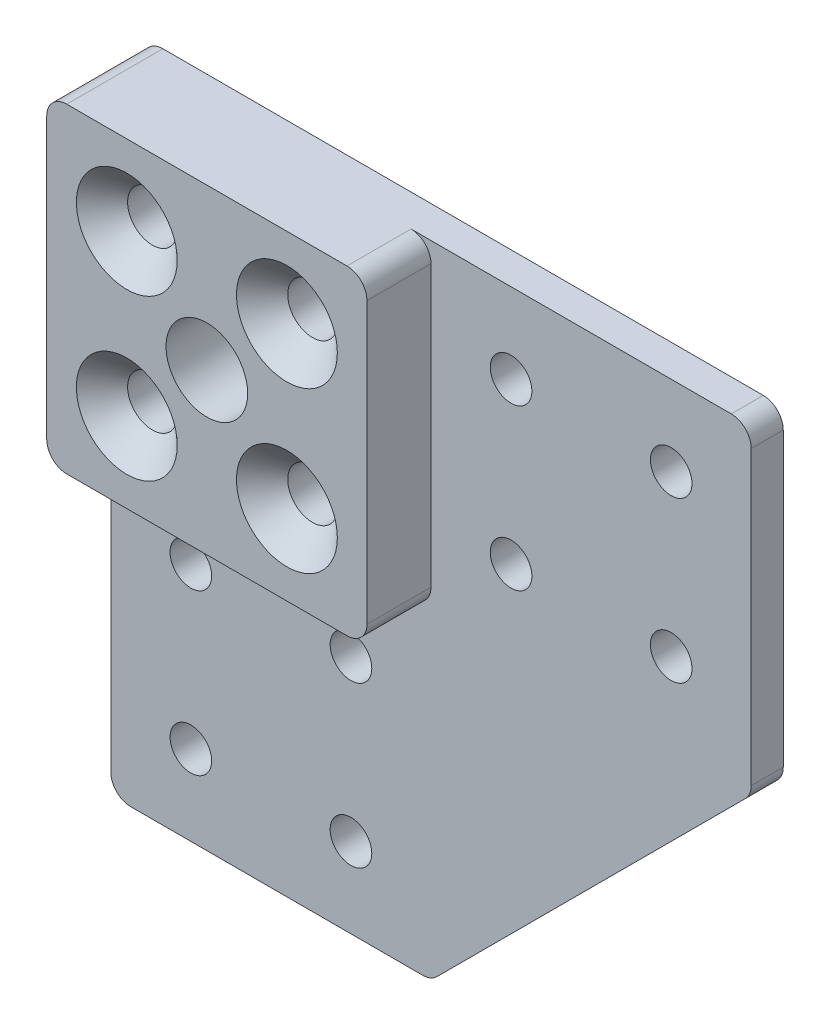
ISO-10303-21;
HEADER;
FILE_DESCRIPTION(('STEP AP214'),'2;1');
FILE_NAME('part.step','',(''),(''),'','','');
FILE_SCHEMA(('AUTOMOTIVE_DESIGN { 1 0 10303 214 1 1 1 1 }'));
ENDSEC;
DATA;
#1=APPLICATION_CONTEXT('core data for automotive mechanical design processes');
#2=APPLICATION_PROTOCOL_DEFINITION('international standard','automotive_design',2000,#1);
#3=PRODUCT_CONTEXT('',#1,'mechanical');
#4=PRODUCT('Part','Part','',(#3));
#5=PRODUCT_RELATED_PRODUCT_CATEGORY('part','',(#4));
#6=PRODUCT_DEFINITION_FORMATION('','',#4);
#7=PRODUCT_DEFINITION_CONTEXT('part definition',#1,'design');
#8=PRODUCT_DEFINITION('design','',#6,#7);
#9=PRODUCT_DEFINITION_SHAPE('','',#8);
#10=(LENGTH_UNIT() NAMED_UNIT(*) SI_UNIT(.MILLI.,.METRE.));
#11=(NAMED_UNIT(*) PLANE_ANGLE_UNIT() SI_UNIT($,.RADIAN.));
#12=(NAMED_UNIT(*) SI_UNIT($,.STERADIAN.) SOLID_ANGLE_UNIT());
#13=UNCERTAINTY_MEASURE_WITH_UNIT(LENGTH_MEASURE(1.E-05),#10,'distance_accuracy_value','');
#14=(GEOMETRIC_REPRESENTATION_CONTEXT(3) GLOBAL_UNCERTAINTY_ASSIGNED_CONTEXT((#13)) GLOBAL_UNIT_ASSIGNED_CONTEXT((#10,
#11,#12)) REPRESENTATION_CONTEXT('',''));
#15=CARTESIAN_POINT('',(0.,0.,0.));
#16=DIRECTION('',(0.,0.,1.));
#17=DIRECTION('',(1.,0.,0.));
#18=AXIS2_PLACEMENT_3D('',#15,#16,#17);
#19=CARTESIAN_POINT('',(0.,0.,4.));
#20=DIRECTION('',(0.,0.,-1.));
#21=DIRECTION('',(-1.,0.,0.));
#22=AXIS2_PLACEMENT_3D('',#19,#20,#21);
#23=PLANE('',#22);
#24=CARTESIAN_POINT('',(70.,-10.0000000000002,4.));
#25=DIRECTION('',(0.,0.,1.));
#26=DIRECTION('',(-1.,0.,0.));
#27=AXIS2_PLACEMENT_3D('',#24,#25,#26);
#28=CIRCLE('',#27,2.60000000000001);
#29=CARTESIAN_POINT('',(67.4,-10.0000000000002,4.));
#30=VERTEX_POINT('',#29);
#31=EDGE_CURVE('E815',#30,#30,#28,.T.);
#32=ORIENTED_EDGE('',*,*,#31,.F.);
#33=EDGE_LOOP('',(#32));
#34=FACE_BOUND('',#33,.T.);
#35=CARTESIAN_POINT('',(10.0000000000002,-70.,4.));
#36=DIRECTION('',(0.,0.,1.));
#37=DIRECTION('',(1.,0.,0.));
#38=AXIS2_PLACEMENT_3D('',#35,#36,#37);
#39=CIRCLE('',#38,2.6);
#40=CARTESIAN_POINT('',(12.6000000000002,-70.,4.));
#41=VERTEX_POINT('',#40);
#42=EDGE_CURVE('E821',#41,#41,#39,.T.);
#43=ORIENTED_EDGE('',*,*,#42,.F.);
#44=EDGE_LOOP('',(#43));
#45=FACE_BOUND('',#44,.T.);
#46=CARTESIAN_POINT('',(30.0000000000002,-70.,4.));
#47=DIRECTION('',(0.,0.,1.));
#48=DIRECTION('',(1.,0.,0.));
#49=AXIS2_PLACEMENT_3D('',#46,#47,#48);
#50=CIRCLE('',#49,2.6);
#51=CARTESIAN_POINT('',(32.6000000000002,-70.,4.));
#52=VERTEX_POINT('',#51);
#53=EDGE_CURVE('E803',#52,#52,#50,.T.);
#54=ORIENTED_EDGE('',*,*,#53,.F.);
#55=EDGE_LOOP('',(#54));
#56=FACE_BOUND('',#55,.T.);
#57=CARTESIAN_POINT('',(30.,-50.,4.));
#58=DIRECTION('',(0.,0.,1.));
#59=DIRECTION('',(1.,0.,0.));
#60=AXIS2_PLACEMENT_3D('',#57,#58,#59);
#61=CIRCLE('',#60,2.6);
#62=CARTESIAN_POINT('',(32.6,-50.,4.));
#63=VERTEX_POINT('',#62);
#64=EDGE_CURVE('E809',#63,#63,#61,.T.);
#65=ORIENTED_EDGE('',*,*,#64,.F.);
#66=EDGE_LOOP('',(#65));
#67=FACE_BOUND('',#66,.T.);
#68=CARTESIAN_POINT('',(70.,-30.0000000000002,4.));
#69=DIRECTION('',(0.,0.,1.));
#70=DIRECTION('',(-1.,0.,0.));
#71=AXIS2_PLACEMENT_3D('',#68,#69,#70);
#72=CIRCLE('',#71,2.60000000000001);
#73=CARTESIAN_POINT('',(67.4,-30.0000000000002,4.));
#74=VERTEX_POINT('',#73);
#75=EDGE_CURVE('E839',#74,#74,#72,.T.);
#76=ORIENTED_EDGE('',*,*,#75,.F.);
#77=EDGE_LOOP('',(#76));
#78=FACE_BOUND('',#77,.T.);
#79=CARTESIAN_POINT('',(50.,-30.,4.));
#80=DIRECTION('',(0.,0.,1.));
#81=DIRECTION('',(-1.,0.,0.));
#82=AXIS2_PLACEMENT_3D('',#79,#80,#81);
#83=CIRCLE('',#82,2.6);
#84=CARTESIAN_POINT('',(47.4,-30.,4.));
#85=VERTEX_POINT('',#84);
#86=EDGE_CURVE('E833',#85,#85,#83,.T.);
#87=ORIENTED_EDGE('',*,*,#86,.F.);
#88=EDGE_LOOP('',(#87));
#89=FACE_BOUND('',#88,.T.);
#90=CARTESIAN_POINT('',(50.,-9.99999999999999,4.));
#91=DIRECTION('',(0.,0.,1.));
#92=DIRECTION('',(-1.,0.,0.));
#93=AXIS2_PLACEMENT_3D('',#90,#91,#92);
#94=CIRCLE('',#93,2.6);
#95=CARTESIAN_POINT('',(47.4,-9.99999999999999,4.));
#96=VERTEX_POINT('',#95);
#97=EDGE_CURVE('E827',#96,#96,#94,.T.);
#98=ORIENTED_EDGE('',*,*,#97,.F.);
#99=EDGE_LOOP('',(#98));
#100=FACE_BOUND('',#99,.T.);
#101=CARTESIAN_POINT('',(10.,-50.,4.));
#102=DIRECTION('',(0.,0.,1.));
#103=DIRECTION('',(1.,0.,0.));
#104=AXIS2_PLACEMENT_3D('',#101,#102,#103);
#105=CIRCLE('',#104,2.6);
#106=CARTESIAN_POINT('',(12.6,-50.,4.));
#107=VERTEX_POINT('',#106);
#108=EDGE_CURVE('E797',#107,#107,#105,.T.);
#109=ORIENTED_EDGE('',*,*,#108,.F.);
#110=EDGE_LOOP('',(#109));
#111=FACE_BOUND('',#110,.T.);
#112=DIRECTION('',(0.,1.,0.));
#113=VECTOR('',#112,1.);
#114=CARTESIAN_POINT('',(80.,0.,4.));
#115=LINE('',#114,#113);
#116=CARTESIAN_POINT('',(80.,-38.9644660940673,4.));
#117=VERTEX_POINT('',#116);
#118=CARTESIAN_POINT('',(80.,-2.5,4.));
#119=VERTEX_POINT('',#118);
#120=EDGE_CURVE('E322',#117,#119,#115,.T.);
#121=ORIENTED_EDGE('',*,*,#120,.T.);
#122=CARTESIAN_POINT('',(77.5,-2.5,4.));
#123=DIRECTION('',(0.,0.,-1.));
#124=DIRECTION('',(-1.,0.,0.));
#125=AXIS2_PLACEMENT_3D('',#122,#123,#124);
#126=CIRCLE('',#125,2.5);
#127=CARTESIAN_POINT('',(77.5,0.,4.));
#128=VERTEX_POINT('',#127);
#129=EDGE_CURVE('E225',#119,#128,#126,.F.);
#130=ORIENTED_EDGE('',*,*,#129,.T.);
#131=DIRECTION('',(-1.,0.,0.));
#132=VECTOR('',#131,1.);
#133=CARTESIAN_POINT('',(0.,0.,4.));
#134=LINE('',#133,#132);
#135=CARTESIAN_POINT('',(37.5,0.,4.));
#136=VERTEX_POINT('',#135);
#137=EDGE_CURVE('E176',#128,#136,#134,.T.);
#138=ORIENTED_EDGE('',*,*,#137,.T.);
#139=CARTESIAN_POINT('',(37.5,-2.5,4.));
#140=DIRECTION('',(0.,0.,-1.));
#141=DIRECTION('',(-1.,0.,0.));
#142=AXIS2_PLACEMENT_3D('',#139,#140,#141);
#143=CIRCLE('',#142,2.5);
#144=CARTESIAN_POINT('',(40.,-2.5,4.));
#145=VERTEX_POINT('',#144);
#146=EDGE_CURVE('E276',#136,#145,#143,.T.);
#147=ORIENTED_EDGE('',*,*,#146,.T.);
#148=DIRECTION('',(0.,1.,0.));
#149=VECTOR('',#148,1.);
#150=CARTESIAN_POINT('',(40.,0.,4.));
#151=LINE('',#150,#149);
#152=CARTESIAN_POINT('',(40.,-37.5,4.));
#153=VERTEX_POINT('',#152);
#154=EDGE_CURVE('E285',#153,#145,#151,.T.);
#155=ORIENTED_EDGE('',*,*,#154,.F.);
#156=CARTESIAN_POINT('',(37.5,-37.5,4.));
#157=DIRECTION('',(0.,0.,-1.));
#158=DIRECTION('',(-1.,0.,0.));
#159=AXIS2_PLACEMENT_3D('',#156,#157,#158);
#160=CIRCLE('',#159,2.5);
#161=CARTESIAN_POINT('',(37.5,-40.,4.));
#162=VERTEX_POINT('',#161);
#163=EDGE_CURVE('E48',#153,#162,#160,.T.);
#164=ORIENTED_EDGE('',*,*,#163,.T.);
#165=DIRECTION('',(1.,0.,0.));
#166=VECTOR('',#165,1.);
#167=CARTESIAN_POINT('',(0.,-40.,4.));
#168=LINE('',#167,#166);
#169=CARTESIAN_POINT('',(2.5,-40.,4.));
#170=VERTEX_POINT('',#169);
#171=EDGE_CURVE('E284',#170,#162,#168,.T.);
#172=ORIENTED_EDGE('',*,*,#171,.F.);
#173=CARTESIAN_POINT('',(2.5,-37.5,4.));
#174=DIRECTION('',(0.,0.,-1.));
#175=DIRECTION('',(-1.,0.,0.));
#176=AXIS2_PLACEMENT_3D('',#173,#174,#175);
#177=CIRCLE('',#176,2.5);
#178=CARTESIAN_POINT('',(0.,-37.5,4.));
#179=VERTEX_POINT('',#178);
#180=EDGE_CURVE('E11',#170,#179,#177,.T.);
#181=ORIENTED_EDGE('',*,*,#180,.T.);
#182=DIRECTION('',(0.,-1.,0.));
#183=VECTOR('',#182,1.);
#184=CARTESIAN_POINT('',(0.,-80.,4.));
#185=LINE('',#184,#183);
#186=CARTESIAN_POINT('',(0.,-77.5,4.));
#187=VERTEX_POINT('',#186);
#188=EDGE_CURVE('E184',#179,#187,#185,.T.);
#189=ORIENTED_EDGE('',*,*,#188,.T.);
#190=CARTESIAN_POINT('',(2.5,-77.5,4.));
#191=DIRECTION('',(0.,0.,-1.));
#192=DIRECTION('',(-1.,0.,0.));
#193=AXIS2_PLACEMENT_3D('',#190,#191,#192);
#194=CIRCLE('',#193,2.5);
#195=CARTESIAN_POINT('',(2.5,-80.,4.));
#196=VERTEX_POINT('',#195);
#197=EDGE_CURVE('E216',#187,#196,#194,.F.);
#198=ORIENTED_EDGE('',*,*,#197,.T.);
#199=DIRECTION('',(1.,0.,0.));
#200=VECTOR('',#199,1.);
#201=CARTESIAN_POINT('',(40.,-80.,4.));
#202=LINE('',#201,#200);
#203=CARTESIAN_POINT('',(38.9644660940673,-80.,4.));
#204=VERTEX_POINT('',#203);
#205=EDGE_CURVE('E190',#196,#204,#202,.T.);
#206=ORIENTED_EDGE('',*,*,#205,.T.);
#207=CARTESIAN_POINT('',(38.9644660940673,-77.5,4.));
#208=DIRECTION('',(0.,0.,-1.));
#209=DIRECTION('',(-1.,0.,0.));
#210=AXIS2_PLACEMENT_3D('',#207,#208,#209);
#211=CIRCLE('',#210,2.5);
#212=CARTESIAN_POINT('',(40.7322330470336,-79.2677669529664,4.));
#213=VERTEX_POINT('',#212);
#214=EDGE_CURVE('E219',#204,#213,#211,.F.);
#215=ORIENTED_EDGE('',*,*,#214,.T.);
#216=DIRECTION('',(0.707106781186548,0.707106781186548,0.));
#217=VECTOR('',#216,1.);
#218=CARTESIAN_POINT('',(80.,-40.,4.));
#219=LINE('',#218,#217);
#220=CARTESIAN_POINT('',(79.2677669529664,-40.7322330470336,4.));
#221=VERTEX_POINT('',#220);
#222=EDGE_CURVE('E318',#213,#221,#219,.T.);
#223=ORIENTED_EDGE('',*,*,#222,.T.);
#224=CARTESIAN_POINT('',(77.5,-38.9644660940673,4.));
#225=DIRECTION('',(0.,0.,-1.));
#226=DIRECTION('',(-1.,0.,0.));
#227=AXIS2_PLACEMENT_3D('',#224,#225,#226);
#228=CIRCLE('',#227,2.5);
#229=EDGE_CURVE('E222',#221,#117,#228,.F.);
#230=ORIENTED_EDGE('',*,*,#229,.T.);
#231=EDGE_LOOP('',(#121,#130,#138,#147,#155,#164,#172,#181,#189,#198,#206,#215,#223,#230));
#232=FACE_BOUND('',#231,.T.);
#233=ADVANCED_FACE('F39',(#34,#45,#56,#67,#78,#89,#100,#111,#232),#23,.F.);
#234=CARTESIAN_POINT('',(0.,-80.,4.));
#235=DIRECTION('',(1.,0.,0.));
#236=DIRECTION('',(0.,1.,0.));
#237=AXIS2_PLACEMENT_3D('',#234,#235,#236);
#238=PLANE('',#237);
#239=DIRECTION('',(0.,-1.,0.));
#240=VECTOR('',#239,1.);
#241=CARTESIAN_POINT('',(0.,-80.,0.));
#242=LINE('',#241,#240);
#243=CARTESIAN_POINT('',(0.,-2.5,0.));
#244=VERTEX_POINT('',#243);
#245=CARTESIAN_POINT('',(0.,-77.5,0.));
#246=VERTEX_POINT('',#245);
#247=EDGE_CURVE('E307',#244,#246,#242,.T.);
#248=ORIENTED_EDGE('',*,*,#247,.T.);
#249=DIRECTION('',(0.,0.,-1.));
#250=VECTOR('',#249,1.);
#251=CARTESIAN_POINT('',(0.,-77.5,4.));
#252=LINE('',#251,#250);
#253=EDGE_CURVE('E249',#246,#187,#252,.F.);
#254=ORIENTED_EDGE('',*,*,#253,.T.);
#255=ORIENTED_EDGE('',*,*,#188,.F.);
#256=DIRECTION('',(0.,0.,-1.));
#257=VECTOR('',#256,1.);
#258=CARTESIAN_POINT('',(0.,-37.5,4.));
#259=LINE('',#258,#257);
#260=CARTESIAN_POINT('',(0.,-37.5,12.));
#261=VERTEX_POINT('',#260);
#262=EDGE_CURVE('E242',#179,#261,#259,.F.);
#263=ORIENTED_EDGE('',*,*,#262,.T.);
#264=DIRECTION('',(0.,-1.,0.));
#265=VECTOR('',#264,1.);
#266=CARTESIAN_POINT('',(0.,0.,12.));
#267=LINE('',#266,#265);
#268=CARTESIAN_POINT('',(0.,-2.5,12.));
#269=VERTEX_POINT('',#268);
#270=EDGE_CURVE('E309',#269,#261,#267,.T.);
#271=ORIENTED_EDGE('',*,*,#270,.F.);
#272=DIRECTION('',(0.,0.,-1.));
#273=VECTOR('',#272,1.);
#274=CARTESIAN_POINT('',(0.,-2.5,4.));
#275=LINE('',#274,#273);
#276=EDGE_CURVE('E245',#269,#244,#275,.T.);
#277=ORIENTED_EDGE('',*,*,#276,.T.);
#278=EDGE_LOOP('',(#248,#254,#255,#263,#271,#277));
#279=FACE_BOUND('',#278,.T.);
#280=ADVANCED_FACE('F358',(#279),#238,.F.);
#281=CARTESIAN_POINT('',(40.,-80.,4.));
#282=DIRECTION('',(0.,1.,0.));
#283=DIRECTION('',(0.,0.,1.));
#284=AXIS2_PLACEMENT_3D('',#281,#282,#283);
#285=PLANE('',#284);
#286=DIRECTION('',(1.,0.,0.));
#287=VECTOR('',#286,1.);
#288=CARTESIAN_POINT('',(40.,-80.,0.));
#289=LINE('',#288,#287);
#290=CARTESIAN_POINT('',(2.5,-80.,0.));
#291=VERTEX_POINT('',#290);
#292=CARTESIAN_POINT('',(38.9644660940673,-80.,0.));
#293=VERTEX_POINT('',#292);
#294=EDGE_CURVE('E330',#291,#293,#289,.T.);
#295=ORIENTED_EDGE('',*,*,#294,.T.);
#296=DIRECTION('',(0.,0.,-1.));
#297=VECTOR('',#296,1.);
#298=CARTESIAN_POINT('',(38.9644660940673,-80.,4.));
#299=LINE('',#298,#297);
#300=EDGE_CURVE('E239',#293,#204,#299,.F.);
#301=ORIENTED_EDGE('',*,*,#300,.T.);
#302=ORIENTED_EDGE('',*,*,#205,.F.);
#303=DIRECTION('',(0.,0.,-1.));
#304=VECTOR('',#303,1.);
#305=CARTESIAN_POINT('',(2.5,-80.,4.));
#306=LINE('',#305,#304);
#307=EDGE_CURVE('E235',#196,#291,#306,.T.);
#308=ORIENTED_EDGE('',*,*,#307,.T.);
#309=EDGE_LOOP('',(#295,#301,#302,#308));
#310=FACE_BOUND('',#309,.T.);
#311=ADVANCED_FACE('F355',(#310),#285,.F.);
#312=CARTESIAN_POINT('',(80.,-40.,4.));
#313=DIRECTION('',(-0.707106781186547,0.707106781186547,0.));
#314=DIRECTION('',(-0.707106781186548,-0.707106781186548,0.));
#315=AXIS2_PLACEMENT_3D('',#312,#313,#314);
#316=PLANE('',#315);
#317=DIRECTION('',(0.707106781186548,0.707106781186548,0.));
#318=VECTOR('',#317,1.);
#319=CARTESIAN_POINT('',(80.,-40.,0.));
#320=LINE('',#319,#318);
#321=CARTESIAN_POINT('',(40.7322330470336,-79.2677669529664,0.));
#322=VERTEX_POINT('',#321);
#323=CARTESIAN_POINT('',(79.2677669529664,-40.7322330470336,0.));
#324=VERTEX_POINT('',#323);
#325=EDGE_CURVE('E192',#322,#324,#320,.T.);
#326=ORIENTED_EDGE('',*,*,#325,.T.);
#327=DIRECTION('',(0.,0.,-1.));
#328=VECTOR('',#327,1.);
#329=CARTESIAN_POINT('',(79.2677669529664,-40.7322330470336,4.));
#330=LINE('',#329,#328);
#331=EDGE_CURVE('E232',#324,#221,#330,.F.);
#332=ORIENTED_EDGE('',*,*,#331,.T.);
#333=ORIENTED_EDGE('',*,*,#222,.F.);
#334=DIRECTION('',(0.,0.,-1.));
#335=VECTOR('',#334,1.);
#336=CARTESIAN_POINT('',(40.7322330470336,-79.2677669529664,4.));
#337=LINE('',#336,#335);
#338=EDGE_CURVE('E228',#213,#322,#337,.T.);
#339=ORIENTED_EDGE('',*,*,#338,.T.);
#340=EDGE_LOOP('',(#326,#332,#333,#339));
#341=FACE_BOUND('',#340,.T.);
#342=ADVANCED_FACE('F338',(#341),#316,.F.);
#343=CARTESIAN_POINT('',(80.,0.,4.));
#344=DIRECTION('',(-1.,0.,0.));
#345=DIRECTION('',(0.,0.,1.));
#346=AXIS2_PLACEMENT_3D('',#343,#344,#345);
#347=PLANE('',#346);
#348=DIRECTION('',(0.,1.,0.));
#349=VECTOR('',#348,1.);
#350=CARTESIAN_POINT('',(80.,0.,0.));
#351=LINE('',#350,#349);
#352=CARTESIAN_POINT('',(80.,-38.9644660940673,0.));
#353=VERTEX_POINT('',#352);
#354=CARTESIAN_POINT('',(80.,-2.5,0.));
#355=VERTEX_POINT('',#354);
#356=EDGE_CURVE('E185',#353,#355,#351,.T.);
#357=ORIENTED_EDGE('',*,*,#356,.T.);
#358=DIRECTION('',(0.,0.,-1.));
#359=VECTOR('',#358,1.);
#360=CARTESIAN_POINT('',(80.,-2.5,4.));
#361=LINE('',#360,#359);
#362=EDGE_CURVE('E160',#355,#119,#361,.F.);
#363=ORIENTED_EDGE('',*,*,#362,.T.);
#364=ORIENTED_EDGE('',*,*,#120,.F.);
#365=DIRECTION('',(0.,0.,-1.));
#366=VECTOR('',#365,1.);
#367=CARTESIAN_POINT('',(80.,-38.9644660940673,4.));
#368=LINE('',#367,#366);
#369=EDGE_CURVE('E166',#117,#353,#368,.T.);
#370=ORIENTED_EDGE('',*,*,#369,.T.);
#371=EDGE_LOOP('',(#357,#363,#364,#370));
#372=FACE_BOUND('',#371,.T.);
#373=ADVANCED_FACE('F347',(#372),#347,.F.);
#374=CARTESIAN_POINT('',(0.,0.,4.));
#375=DIRECTION('',(0.,-1.,0.));
#376=DIRECTION('',(0.,0.,-1.));
#377=AXIS2_PLACEMENT_3D('',#374,#375,#376);
#378=PLANE('',#377);
#379=ORIENTED_EDGE('',*,*,#137,.F.);
#380=DIRECTION('',(0.,0.,-1.));
#381=VECTOR('',#380,1.);
#382=CARTESIAN_POINT('',(77.5,0.,4.));
#383=LINE('',#382,#381);
#384=CARTESIAN_POINT('',(77.5,0.,0.));
#385=VERTEX_POINT('',#384);
#386=EDGE_CURVE('E159',#128,#385,#383,.T.);
#387=ORIENTED_EDGE('',*,*,#386,.T.);
#388=DIRECTION('',(-1.,0.,0.));
#389=VECTOR('',#388,1.);
#390=CARTESIAN_POINT('',(0.,0.,0.));
#391=LINE('',#390,#389);
#392=CARTESIAN_POINT('',(2.5,0.,0.));
#393=VERTEX_POINT('',#392);
#394=EDGE_CURVE('E173',#385,#393,#391,.T.);
#395=ORIENTED_EDGE('',*,*,#394,.T.);
#396=DIRECTION('',(0.,0.,-1.));
#397=VECTOR('',#396,1.);
#398=CARTESIAN_POINT('',(2.5,0.,4.));
#399=LINE('',#398,#397);
#400=CARTESIAN_POINT('',(2.5,0.,12.));
#401=VERTEX_POINT('',#400);
#402=EDGE_CURVE('E179',#393,#401,#399,.F.);
#403=ORIENTED_EDGE('',*,*,#402,.T.);
#404=DIRECTION('',(-1.,0.,0.));
#405=VECTOR('',#404,1.);
#406=CARTESIAN_POINT('',(0.,0.,12.));
#407=LINE('',#406,#405);
#408=CARTESIAN_POINT('',(37.5,0.,12.));
#409=VERTEX_POINT('',#408);
#410=EDGE_CURVE('E301',#409,#401,#407,.T.);
#411=ORIENTED_EDGE('',*,*,#410,.F.);
#412=DIRECTION('',(0.,0.,-1.));
#413=VECTOR('',#412,1.);
#414=CARTESIAN_POINT('',(37.5,0.,4.));
#415=LINE('',#414,#413);
#416=EDGE_CURVE('E196',#409,#136,#415,.T.);
#417=ORIENTED_EDGE('',*,*,#416,.T.);
#418=EDGE_LOOP('',(#379,#387,#395,#403,#411,#417));
#419=FACE_BOUND('',#418,.T.);
#420=ADVANCED_FACE('F172',(#419),#378,.F.);
#421=CARTESIAN_POINT('',(0.,0.,0.));
#422=DIRECTION('',(0.,0.,-1.));
#423=DIRECTION('',(-1.,0.,0.));
#424=AXIS2_PLACEMENT_3D('',#421,#422,#423);
#425=PLANE('',#424);
#426=CARTESIAN_POINT('',(70.,-10.0000000000002,0.));
#427=DIRECTION('',(0.,0.,1.));
#428=DIRECTION('',(-1.,0.,0.));
#429=AXIS2_PLACEMENT_3D('',#426,#427,#428);
#430=CIRCLE('',#429,2.60000000000001);
#431=CARTESIAN_POINT('',(67.4,-10.0000000000002,0.));
#432=VERTEX_POINT('',#431);
#433=EDGE_CURVE('E379',#432,#432,#430,.T.);
#434=ORIENTED_EDGE('',*,*,#433,.T.);
#435=EDGE_LOOP('',(#434));
#436=FACE_BOUND('',#435,.T.);
#437=CARTESIAN_POINT('',(10.0000000000002,-70.,0.));
#438=DIRECTION('',(0.,0.,1.));
#439=DIRECTION('',(1.,0.,0.));
#440=AXIS2_PLACEMENT_3D('',#437,#438,#439);
#441=CIRCLE('',#440,2.6);
#442=CARTESIAN_POINT('',(12.6000000000002,-70.,0.));
#443=VERTEX_POINT('',#442);
#444=EDGE_CURVE('E383',#443,#443,#441,.T.);
#445=ORIENTED_EDGE('',*,*,#444,.T.);
#446=EDGE_LOOP('',(#445));
#447=FACE_BOUND('',#446,.T.);
#448=CARTESIAN_POINT('',(30.0000000000002,-70.,0.));
#449=DIRECTION('',(0.,0.,1.));
#450=DIRECTION('',(1.,0.,0.));
#451=AXIS2_PLACEMENT_3D('',#448,#449,#450);
#452=CIRCLE('',#451,2.6);
#453=CARTESIAN_POINT('',(32.6000000000002,-70.,0.));
#454=VERTEX_POINT('',#453);
#455=EDGE_CURVE('E387',#454,#454,#452,.T.);
#456=ORIENTED_EDGE('',*,*,#455,.T.);
#457=EDGE_LOOP('',(#456));
#458=FACE_BOUND('',#457,.T.);
#459=CARTESIAN_POINT('',(30.,-50.,0.));
#460=DIRECTION('',(0.,0.,1.));
#461=DIRECTION('',(1.,0.,0.));
#462=AXIS2_PLACEMENT_3D('',#459,#460,#461);
#463=CIRCLE('',#462,2.6);
#464=CARTESIAN_POINT('',(32.6,-50.,0.));
#465=VERTEX_POINT('',#464);
#466=EDGE_CURVE('E391',#465,#465,#463,.T.);
#467=ORIENTED_EDGE('',*,*,#466,.T.);
#468=EDGE_LOOP('',(#467));
#469=FACE_BOUND('',#468,.T.);
#470=CARTESIAN_POINT('',(70.,-30.0000000000002,0.));
#471=DIRECTION('',(0.,0.,1.));
#472=DIRECTION('',(-1.,0.,0.));
#473=AXIS2_PLACEMENT_3D('',#470,#471,#472);
#474=CIRCLE('',#473,2.60000000000001);
#475=CARTESIAN_POINT('',(67.4,-30.0000000000002,0.));
#476=VERTEX_POINT('',#475);
#477=EDGE_CURVE('E395',#476,#476,#474,.T.);
#478=ORIENTED_EDGE('',*,*,#477,.T.);
#479=EDGE_LOOP('',(#478));
#480=FACE_BOUND('',#479,.T.);
#481=CARTESIAN_POINT('',(50.,-30.,0.));
#482=DIRECTION('',(0.,0.,1.));
#483=DIRECTION('',(-1.,0.,0.));
#484=AXIS2_PLACEMENT_3D('',#481,#482,#483);
#485=CIRCLE('',#484,2.6);
#486=CARTESIAN_POINT('',(47.4,-30.,0.));
#487=VERTEX_POINT('',#486);
#488=EDGE_CURVE('E399',#487,#487,#485,.T.);
#489=ORIENTED_EDGE('',*,*,#488,.T.);
#490=EDGE_LOOP('',(#489));
#491=FACE_BOUND('',#490,.T.);
#492=CARTESIAN_POINT('',(50.,-9.99999999999999,0.));
#493=DIRECTION('',(0.,0.,1.));
#494=DIRECTION('',(-1.,0.,0.));
#495=AXIS2_PLACEMENT_3D('',#492,#493,#494);
#496=CIRCLE('',#495,2.6);
#497=CARTESIAN_POINT('',(47.4,-9.99999999999999,0.));
#498=VERTEX_POINT('',#497);
#499=EDGE_CURVE('E403',#498,#498,#496,.T.);
#500=ORIENTED_EDGE('',*,*,#499,.T.);
#501=EDGE_LOOP('',(#500));
#502=FACE_BOUND('',#501,.T.);
#503=CARTESIAN_POINT('',(10.,-50.,0.));
#504=DIRECTION('',(0.,0.,1.));
#505=DIRECTION('',(1.,0.,0.));
#506=AXIS2_PLACEMENT_3D('',#503,#504,#505);
#507=CIRCLE('',#506,2.6);
#508=CARTESIAN_POINT('',(12.6,-50.,0.));
#509=VERTEX_POINT('',#508);
#510=EDGE_CURVE('E407',#509,#509,#507,.T.);
#511=ORIENTED_EDGE('',*,*,#510,.T.);
#512=EDGE_LOOP('',(#511));
#513=FACE_BOUND('',#512,.T.);
#514=CARTESIAN_POINT('',(20.,-20.,0.));
#515=DIRECTION('',(0.,0.,1.));
#516=DIRECTION('',(1.,0.,0.));
#517=AXIS2_PLACEMENT_3D('',#514,#515,#516);
#518=CIRCLE('',#517,5.1);
#519=CARTESIAN_POINT('',(25.1,-20.,0.));
#520=VERTEX_POINT('',#519);
#521=EDGE_CURVE('E411',#520,#520,#518,.T.);
#522=ORIENTED_EDGE('',*,*,#521,.T.);
#523=EDGE_LOOP('',(#522));
#524=FACE_BOUND('',#523,.T.);
#525=CARTESIAN_POINT('',(10.,-30.,0.));
#526=DIRECTION('',(0.,0.,1.));
#527=DIRECTION('',(1.,0.,0.));
#528=AXIS2_PLACEMENT_3D('',#525,#526,#527);
#529=CIRCLE('',#528,3.1);
#530=CARTESIAN_POINT('',(13.1,-30.,0.));
#531=VERTEX_POINT('',#530);
#532=EDGE_CURVE('E415',#531,#531,#529,.T.);
#533=ORIENTED_EDGE('',*,*,#532,.T.);
#534=EDGE_LOOP('',(#533));
#535=FACE_BOUND('',#534,.T.);
#536=CARTESIAN_POINT('',(10.,-10.,0.));
#537=DIRECTION('',(0.,0.,1.));
#538=DIRECTION('',(1.,0.,0.));
#539=AXIS2_PLACEMENT_3D('',#536,#537,#538);
#540=CIRCLE('',#539,3.1);
#541=CARTESIAN_POINT('',(13.1,-10.,0.));
#542=VERTEX_POINT('',#541);
#543=EDGE_CURVE('E419',#542,#542,#540,.T.);
#544=ORIENTED_EDGE('',*,*,#543,.T.);
#545=EDGE_LOOP('',(#544));
#546=FACE_BOUND('',#545,.T.);
#547=CARTESIAN_POINT('',(30.,-10.,0.));
#548=DIRECTION('',(0.,0.,1.));
#549=DIRECTION('',(1.,0.,0.));
#550=AXIS2_PLACEMENT_3D('',#547,#548,#549);
#551=CIRCLE('',#550,3.1);
#552=CARTESIAN_POINT('',(33.1,-10.,0.));
#553=VERTEX_POINT('',#552);
#554=EDGE_CURVE('E423',#553,#553,#551,.T.);
#555=ORIENTED_EDGE('',*,*,#554,.T.);
#556=EDGE_LOOP('',(#555));
#557=FACE_BOUND('',#556,.T.);
#558=CARTESIAN_POINT('',(30.,-30.,0.));
#559=DIRECTION('',(0.,0.,1.));
#560=DIRECTION('',(1.,0.,0.));
#561=AXIS2_PLACEMENT_3D('',#558,#559,#560);
#562=CIRCLE('',#561,3.1);
#563=CARTESIAN_POINT('',(33.1,-30.,0.));
#564=VERTEX_POINT('',#563);
#565=EDGE_CURVE('E294',#564,#564,#562,.T.);
#566=ORIENTED_EDGE('',*,*,#565,.T.);
#567=EDGE_LOOP('',(#566));
#568=FACE_BOUND('',#567,.T.);
#569=ORIENTED_EDGE('',*,*,#394,.F.);
#570=CARTESIAN_POINT('',(77.5,-2.5,0.));
#571=DIRECTION('',(0.,0.,-1.));
#572=DIRECTION('',(-1.,0.,0.));
#573=AXIS2_PLACEMENT_3D('',#570,#571,#572);
#574=CIRCLE('',#573,2.5);
#575=EDGE_CURVE('E155',#385,#355,#574,.T.);
#576=ORIENTED_EDGE('',*,*,#575,.T.);
#577=ORIENTED_EDGE('',*,*,#356,.F.);
#578=CARTESIAN_POINT('',(77.5,-38.9644660940673,0.));
#579=DIRECTION('',(0.,0.,-1.));
#580=DIRECTION('',(-1.,0.,0.));
#581=AXIS2_PLACEMENT_3D('',#578,#579,#580);
#582=CIRCLE('',#581,2.5);
#583=EDGE_CURVE('E167',#353,#324,#582,.T.);
#584=ORIENTED_EDGE('',*,*,#583,.T.);
#585=ORIENTED_EDGE('',*,*,#325,.F.);
#586=CARTESIAN_POINT('',(38.9644660940673,-77.5,0.));
#587=DIRECTION('',(0.,0.,-1.));
#588=DIRECTION('',(-1.,0.,0.));
#589=AXIS2_PLACEMENT_3D('',#586,#587,#588);
#590=CIRCLE('',#589,2.5);
#591=EDGE_CURVE('E206',#322,#293,#590,.T.);
#592=ORIENTED_EDGE('',*,*,#591,.T.);
#593=ORIENTED_EDGE('',*,*,#294,.F.);
#594=CARTESIAN_POINT('',(2.5,-77.5,0.));
#595=DIRECTION('',(0.,0.,-1.));
#596=DIRECTION('',(-1.,0.,0.));
#597=AXIS2_PLACEMENT_3D('',#594,#595,#596);
#598=CIRCLE('',#597,2.5);
#599=EDGE_CURVE('E203',#291,#246,#598,.T.);
#600=ORIENTED_EDGE('',*,*,#599,.T.);
#601=ORIENTED_EDGE('',*,*,#247,.F.);
#602=CARTESIAN_POINT('',(2.5,-2.5,0.));
#603=DIRECTION('',(0.,0.,-1.));
#604=DIRECTION('',(-1.,0.,0.));
#605=AXIS2_PLACEMENT_3D('',#602,#603,#604);
#606=CIRCLE('',#605,2.5);
#607=EDGE_CURVE('E178',#244,#393,#606,.T.);
#608=ORIENTED_EDGE('',*,*,#607,.T.);
#609=EDGE_LOOP('',(#569,#576,#577,#584,#585,#592,#593,#600,#601,#608));
#610=FACE_BOUND('',#609,.T.);
#611=ADVANCED_FACE('F181',(#436,#447,#458,#469,#480,#491,#502,#513,#524,#535,#546,#557,#568,
#610),#425,.T.);
#612=CARTESIAN_POINT('',(0.,-40.,12.));
#613=DIRECTION('',(0.,1.,0.));
#614=DIRECTION('',(0.,0.,1.));
#615=AXIS2_PLACEMENT_3D('',#612,#613,#614);
#616=PLANE('',#615);
#617=ORIENTED_EDGE('',*,*,#171,.T.);
#618=DIRECTION('',(0.,0.,-1.));
#619=VECTOR('',#618,1.);
#620=CARTESIAN_POINT('',(37.5,-40.,12.));
#621=LINE('',#620,#619);
#622=CARTESIAN_POINT('',(37.5,-40.,12.));
#623=VERTEX_POINT('',#622);
#624=EDGE_CURVE('E273',#162,#623,#621,.F.);
#625=ORIENTED_EDGE('',*,*,#624,.T.);
#626=DIRECTION('',(1.,0.,0.));
#627=VECTOR('',#626,1.);
#628=CARTESIAN_POINT('',(0.,-40.,12.));
#629=LINE('',#628,#627);
#630=CARTESIAN_POINT('',(2.5,-40.,12.));
#631=VERTEX_POINT('',#630);
#632=EDGE_CURVE('E302',#631,#623,#629,.T.);
#633=ORIENTED_EDGE('',*,*,#632,.F.);
#634=DIRECTION('',(0.,0.,-1.));
#635=VECTOR('',#634,1.);
#636=CARTESIAN_POINT('',(2.5,-40.,12.));
#637=LINE('',#636,#635);
#638=EDGE_CURVE('E269',#631,#170,#637,.T.);
#639=ORIENTED_EDGE('',*,*,#638,.T.);
#640=EDGE_LOOP('',(#617,#625,#633,#639));
#641=FACE_BOUND('',#640,.T.);
#642=ADVANCED_FACE('F290',(#641),#616,.F.);
#643=CARTESIAN_POINT('',(40.,0.,12.));
#644=DIRECTION('',(-1.,0.,0.));
#645=DIRECTION('',(0.,-1.,0.));
#646=AXIS2_PLACEMENT_3D('',#643,#644,#645);
#647=PLANE('',#646);
#648=ORIENTED_EDGE('',*,*,#154,.T.);
#649=DIRECTION('',(0.,0.,-1.));
#650=VECTOR('',#649,1.);
#651=CARTESIAN_POINT('',(40.,-2.5,12.));
#652=LINE('',#651,#650);
#653=CARTESIAN_POINT('',(40.,-2.5,12.));
#654=VERTEX_POINT('',#653);
#655=EDGE_CURVE('E55',#145,#654,#652,.F.);
#656=ORIENTED_EDGE('',*,*,#655,.T.);
#657=DIRECTION('',(0.,1.,0.));
#658=VECTOR('',#657,1.);
#659=CARTESIAN_POINT('',(40.,0.,12.));
#660=LINE('',#659,#658);
#661=CARTESIAN_POINT('',(40.,-37.5,12.));
#662=VERTEX_POINT('',#661);
#663=EDGE_CURVE('E298',#662,#654,#660,.T.);
#664=ORIENTED_EDGE('',*,*,#663,.F.);
#665=DIRECTION('',(0.,0.,-1.));
#666=VECTOR('',#665,1.);
#667=CARTESIAN_POINT('',(40.,-37.5,12.));
#668=LINE('',#667,#666);
#669=EDGE_CURVE('E263',#662,#153,#668,.T.);
#670=ORIENTED_EDGE('',*,*,#669,.T.);
#671=EDGE_LOOP('',(#648,#656,#664,#670));
#672=FACE_BOUND('',#671,.T.);
#673=ADVANCED_FACE('F297',(#672),#647,.F.);
#674=CARTESIAN_POINT('',(0.,0.,12.));
#675=DIRECTION('',(0.,0.,1.));
#676=DIRECTION('',(1.,0.,0.));
#677=AXIS2_PLACEMENT_3D('',#674,#675,#676);
#678=PLANE('',#677);
#679=CARTESIAN_POINT('',(20.,-20.,12.));
#680=DIRECTION('',(0.,0.,1.));
#681=DIRECTION('',(1.,0.,0.));
#682=AXIS2_PLACEMENT_3D('',#679,#680,#681);
#683=CIRCLE('',#682,5.1);
#684=CARTESIAN_POINT('',(25.1,-20.,12.));
#685=VERTEX_POINT('',#684);
#686=EDGE_CURVE('E791',#685,#685,#683,.T.);
#687=ORIENTED_EDGE('',*,*,#686,.F.);
#688=EDGE_LOOP('',(#687));
#689=FACE_BOUND('',#688,.T.);
#690=CARTESIAN_POINT('',(10.,-30.,12.));
#691=DIRECTION('',(0.,0.,1.));
#692=DIRECTION('',(1.,0.,0.));
#693=AXIS2_PLACEMENT_3D('',#690,#691,#692);
#694=CIRCLE('',#693,6.3);
#695=CARTESIAN_POINT('',(16.3,-30.,12.));
#696=VERTEX_POINT('',#695);
#697=EDGE_CURVE('E787',#696,#696,#694,.T.);
#698=ORIENTED_EDGE('',*,*,#697,.F.);
#699=EDGE_LOOP('',(#698));
#700=FACE_BOUND('',#699,.T.);
#701=CARTESIAN_POINT('',(10.,-10.,12.));
#702=DIRECTION('',(0.,0.,1.));
#703=DIRECTION('',(1.,0.,0.));
#704=AXIS2_PLACEMENT_3D('',#701,#702,#703);
#705=CIRCLE('',#704,6.3);
#706=CARTESIAN_POINT('',(16.3,-10.,12.));
#707=VERTEX_POINT('',#706);
#708=EDGE_CURVE('E777',#707,#707,#705,.T.);
#709=ORIENTED_EDGE('',*,*,#708,.F.);
#710=EDGE_LOOP('',(#709));
#711=FACE_BOUND('',#710,.T.);
#712=CARTESIAN_POINT('',(30.,-10.,12.));
#713=DIRECTION('',(0.,0.,1.));
#714=DIRECTION('',(1.,0.,0.));
#715=AXIS2_PLACEMENT_3D('',#712,#713,#714);
#716=CIRCLE('',#715,6.3);
#717=CARTESIAN_POINT('',(36.3,-10.,12.));
#718=VERTEX_POINT('',#717);
#719=EDGE_CURVE('E767',#718,#718,#716,.T.);
#720=ORIENTED_EDGE('',*,*,#719,.F.);
#721=EDGE_LOOP('',(#720));
#722=FACE_BOUND('',#721,.T.);
#723=CARTESIAN_POINT('',(30.,-30.,12.));
#724=DIRECTION('',(0.,0.,1.));
#725=DIRECTION('',(1.,0.,0.));
#726=AXIS2_PLACEMENT_3D('',#723,#724,#725);
#727=CIRCLE('',#726,6.3);
#728=CARTESIAN_POINT('',(36.3,-30.,12.));
#729=VERTEX_POINT('',#728);
#730=EDGE_CURVE('E432',#729,#729,#727,.T.);
#731=ORIENTED_EDGE('',*,*,#730,.F.);
#732=EDGE_LOOP('',(#731));
#733=FACE_BOUND('',#732,.T.);
#734=ORIENTED_EDGE('',*,*,#410,.T.);
#735=CARTESIAN_POINT('',(2.5,-2.5,12.));
#736=DIRECTION('',(0.,0.,1.));
#737=DIRECTION('',(1.,0.,0.));
#738=AXIS2_PLACEMENT_3D('',#735,#736,#737);
#739=CIRCLE('',#738,2.5);
#740=EDGE_CURVE('E260',#401,#269,#739,.T.);
#741=ORIENTED_EDGE('',*,*,#740,.T.);
#742=ORIENTED_EDGE('',*,*,#270,.T.);
#743=CARTESIAN_POINT('',(2.5,-37.5,12.));
#744=DIRECTION('',(0.,0.,1.));
#745=DIRECTION('',(1.,0.,0.));
#746=AXIS2_PLACEMENT_3D('',#743,#744,#745);
#747=CIRCLE('',#746,2.5);
#748=EDGE_CURVE('E252',#261,#631,#747,.T.);
#749=ORIENTED_EDGE('',*,*,#748,.T.);
#750=ORIENTED_EDGE('',*,*,#632,.T.);
#751=CARTESIAN_POINT('',(37.5,-37.5,12.));
#752=DIRECTION('',(0.,0.,1.));
#753=DIRECTION('',(1.,0.,0.));
#754=AXIS2_PLACEMENT_3D('',#751,#752,#753);
#755=CIRCLE('',#754,2.5);
#756=EDGE_CURVE('E62',#623,#662,#755,.T.);
#757=ORIENTED_EDGE('',*,*,#756,.T.);
#758=ORIENTED_EDGE('',*,*,#663,.T.);
#759=CARTESIAN_POINT('',(37.5,-2.5,12.));
#760=DIRECTION('',(0.,0.,1.));
#761=DIRECTION('',(1.,0.,0.));
#762=AXIS2_PLACEMENT_3D('',#759,#760,#761);
#763=CIRCLE('',#762,2.5);
#764=EDGE_CURVE('E257',#654,#409,#763,.T.);
#765=ORIENTED_EDGE('',*,*,#764,.T.);
#766=EDGE_LOOP('',(#734,#741,#742,#749,#750,#757,#758,#765));
#767=FACE_BOUND('',#766,.T.);
#768=ADVANCED_FACE('F439',(#689,#700,#711,#722,#733,#767),#678,.T.);
#769=CARTESIAN_POINT('',(30.,-30.,12.));
#770=DIRECTION('',(0.,0.,1.));
#771=DIRECTION('',(1.,0.,0.));
#772=AXIS2_PLACEMENT_3D('',#769,#770,#771);
#773=CYLINDRICAL_SURFACE('',#772,3.1);
#774=ORIENTED_EDGE('',*,*,#565,.F.);
#775=EDGE_LOOP('',(#774));
#776=FACE_BOUND('',#775,.T.);
#777=CARTESIAN_POINT('',(30.,-30.,8.8));
#778=DIRECTION('',(0.,0.,1.));
#779=DIRECTION('',(1.,0.,0.));
#780=AXIS2_PLACEMENT_3D('',#777,#778,#779);
#781=CIRCLE('',#780,3.1);
#782=CARTESIAN_POINT('',(33.1,-30.,8.8));
#783=VERTEX_POINT('',#782);
#784=EDGE_CURVE('E428',#783,#783,#781,.T.);
#785=ORIENTED_EDGE('',*,*,#784,.T.);
#786=EDGE_LOOP('',(#785));
#787=FACE_BOUND('',#786,.T.);
#788=ADVANCED_FACE('F530',(#776,#787),#773,.F.);
#789=CARTESIAN_POINT('',(30.,-30.,12.));
#790=DIRECTION('',(0.,0.,1.));
#791=DIRECTION('',(1.,0.,0.));
#792=AXIS2_PLACEMENT_3D('',#789,#790,#791);
#793=CONICAL_SURFACE('',#792,6.3,0.785398163397448);
#794=ORIENTED_EDGE('',*,*,#784,.F.);
#795=EDGE_LOOP('',(#794));
#796=FACE_BOUND('',#795,.T.);
#797=ORIENTED_EDGE('',*,*,#730,.T.);
#798=EDGE_LOOP('',(#797));
#799=FACE_BOUND('',#798,.T.);
#800=ADVANCED_FACE('F733',(#796,#799),#793,.F.);
#801=CARTESIAN_POINT('',(30.,-10.,12.));
#802=DIRECTION('',(0.,0.,1.));
#803=DIRECTION('',(1.,0.,0.));
#804=AXIS2_PLACEMENT_3D('',#801,#802,#803);
#805=CYLINDRICAL_SURFACE('',#804,3.1);
#806=ORIENTED_EDGE('',*,*,#554,.F.);
#807=EDGE_LOOP('',(#806));
#808=FACE_BOUND('',#807,.T.);
#809=CARTESIAN_POINT('',(30.,-10.,8.8));
#810=DIRECTION('',(0.,0.,1.));
#811=DIRECTION('',(1.,0.,0.));
#812=AXIS2_PLACEMENT_3D('',#809,#810,#811);
#813=CIRCLE('',#812,3.1);
#814=CARTESIAN_POINT('',(33.1,-10.,8.8));
#815=VERTEX_POINT('',#814);
#816=EDGE_CURVE('E761',#815,#815,#813,.T.);
#817=ORIENTED_EDGE('',*,*,#816,.T.);
#818=EDGE_LOOP('',(#817));
#819=FACE_BOUND('',#818,.T.);
#820=ADVANCED_FACE('F723',(#808,#819),#805,.F.);
#821=CARTESIAN_POINT('',(30.,-10.,12.));
#822=DIRECTION('',(0.,0.,1.));
#823=DIRECTION('',(1.,0.,0.));
#824=AXIS2_PLACEMENT_3D('',#821,#822,#823);
#825=CONICAL_SURFACE('',#824,6.3,0.785398163397449);
#826=ORIENTED_EDGE('',*,*,#816,.F.);
#827=EDGE_LOOP('',(#826));
#828=FACE_BOUND('',#827,.T.);
#829=ORIENTED_EDGE('',*,*,#719,.T.);
#830=EDGE_LOOP('',(#829));
#831=FACE_BOUND('',#830,.T.);
#832=ADVANCED_FACE('F713',(#828,#831),#825,.F.);
#833=CARTESIAN_POINT('',(10.,-10.,12.));
#834=DIRECTION('',(0.,0.,1.));
#835=DIRECTION('',(1.,0.,0.));
#836=AXIS2_PLACEMENT_3D('',#833,#834,#835);
#837=CYLINDRICAL_SURFACE('',#836,3.1);
#838=ORIENTED_EDGE('',*,*,#543,.F.);
#839=EDGE_LOOP('',(#838));
#840=FACE_BOUND('',#839,.T.);
#841=CARTESIAN_POINT('',(10.,-10.,8.8));
#842=DIRECTION('',(0.,0.,1.));
#843=DIRECTION('',(1.,0.,0.));
#844=AXIS2_PLACEMENT_3D('',#841,#842,#843);
#845=CIRCLE('',#844,3.1);
#846=CARTESIAN_POINT('',(13.1,-10.,8.8));
#847=VERTEX_POINT('',#846);
#848=EDGE_CURVE('E773',#847,#847,#845,.T.);
#849=ORIENTED_EDGE('',*,*,#848,.T.);
#850=EDGE_LOOP('',(#849));
#851=FACE_BOUND('',#850,.T.);
#852=ADVANCED_FACE('F703',(#840,#851),#837,.F.);
#853=CARTESIAN_POINT('',(10.,-10.,12.));
#854=DIRECTION('',(0.,0.,1.));
#855=DIRECTION('',(1.,0.,0.));
#856=AXIS2_PLACEMENT_3D('',#853,#854,#855);
#857=CONICAL_SURFACE('',#856,6.3,0.785398163397449);
#858=ORIENTED_EDGE('',*,*,#848,.F.);
#859=EDGE_LOOP('',(#858));
#860=FACE_BOUND('',#859,.T.);
#861=ORIENTED_EDGE('',*,*,#708,.T.);
#862=EDGE_LOOP('',(#861));
#863=FACE_BOUND('',#862,.T.);
#864=ADVANCED_FACE('F693',(#860,#863),#857,.F.);
#865=CARTESIAN_POINT('',(10.,-30.,12.));
#866=DIRECTION('',(0.,0.,1.));
#867=DIRECTION('',(1.,0.,0.));
#868=AXIS2_PLACEMENT_3D('',#865,#866,#867);
#869=CYLINDRICAL_SURFACE('',#868,3.1);
#870=ORIENTED_EDGE('',*,*,#532,.F.);
#871=EDGE_LOOP('',(#870));
#872=FACE_BOUND('',#871,.T.);
#873=CARTESIAN_POINT('',(10.,-30.,8.8));
#874=DIRECTION('',(0.,0.,1.));
#875=DIRECTION('',(1.,0.,0.));
#876=AXIS2_PLACEMENT_3D('',#873,#874,#875);
#877=CIRCLE('',#876,3.1);
#878=CARTESIAN_POINT('',(13.1,-30.,8.8));
#879=VERTEX_POINT('',#878);
#880=EDGE_CURVE('E783',#879,#879,#877,.T.);
#881=ORIENTED_EDGE('',*,*,#880,.T.);
#882=EDGE_LOOP('',(#881));
#883=FACE_BOUND('',#882,.T.);
#884=ADVANCED_FACE('F683',(#872,#883),#869,.F.);
#885=CARTESIAN_POINT('',(10.,-30.,12.));
#886=DIRECTION('',(0.,0.,1.));
#887=DIRECTION('',(1.,0.,0.));
#888=AXIS2_PLACEMENT_3D('',#885,#886,#887);
#889=CONICAL_SURFACE('',#888,6.3,0.785398163397449);
#890=ORIENTED_EDGE('',*,*,#880,.F.);
#891=EDGE_LOOP('',(#890));
#892=FACE_BOUND('',#891,.T.);
#893=ORIENTED_EDGE('',*,*,#697,.T.);
#894=EDGE_LOOP('',(#893));
#895=FACE_BOUND('',#894,.T.);
#896=ADVANCED_FACE('F673',(#892,#895),#889,.F.);
#897=CARTESIAN_POINT('',(20.,-20.,0.));
#898=DIRECTION('',(0.,0.,1.));
#899=DIRECTION('',(1.,0.,0.));
#900=AXIS2_PLACEMENT_3D('',#897,#898,#899);
#901=CYLINDRICAL_SURFACE('',#900,5.1);
#902=ORIENTED_EDGE('',*,*,#521,.F.);
#903=EDGE_LOOP('',(#902));
#904=FACE_BOUND('',#903,.T.);
#905=ORIENTED_EDGE('',*,*,#686,.T.);
#906=EDGE_LOOP('',(#905));
#907=FACE_BOUND('',#906,.T.);
#908=ADVANCED_FACE('F663',(#904,#907),#901,.F.);
#909=CARTESIAN_POINT('',(10.,-50.,0.));
#910=DIRECTION('',(0.,0.,1.));
#911=DIRECTION('',(1.,0.,0.));
#912=AXIS2_PLACEMENT_3D('',#909,#910,#911);
#913=CYLINDRICAL_SURFACE('',#912,2.6);
#914=ORIENTED_EDGE('',*,*,#510,.F.);
#915=EDGE_LOOP('',(#914));
#916=FACE_BOUND('',#915,.T.);
#917=ORIENTED_EDGE('',*,*,#108,.T.);
#918=EDGE_LOOP('',(#917));
#919=FACE_BOUND('',#918,.T.);
#920=ADVANCED_FACE('F653',(#916,#919),#913,.F.);
#921=CARTESIAN_POINT('',(50.,-9.99999999999999,0.));
#922=DIRECTION('',(0.,0.,1.));
#923=DIRECTION('',(1.,0.,0.));
#924=AXIS2_PLACEMENT_3D('',#921,#922,#923);
#925=CYLINDRICAL_SURFACE('',#924,2.6);
#926=ORIENTED_EDGE('',*,*,#499,.F.);
#927=EDGE_LOOP('',(#926));
#928=FACE_BOUND('',#927,.T.);
#929=ORIENTED_EDGE('',*,*,#97,.T.);
#930=EDGE_LOOP('',(#929));
#931=FACE_BOUND('',#930,.T.);
#932=ADVANCED_FACE('F643',(#928,#931),#925,.F.);
#933=CARTESIAN_POINT('',(50.,-30.,0.));
#934=DIRECTION('',(0.,0.,1.));
#935=DIRECTION('',(1.,0.,0.));
#936=AXIS2_PLACEMENT_3D('',#933,#934,#935);
#937=CYLINDRICAL_SURFACE('',#936,2.6);
#938=ORIENTED_EDGE('',*,*,#488,.F.);
#939=EDGE_LOOP('',(#938));
#940=FACE_BOUND('',#939,.T.);
#941=ORIENTED_EDGE('',*,*,#86,.T.);
#942=EDGE_LOOP('',(#941));
#943=FACE_BOUND('',#942,.T.);
#944=ADVANCED_FACE('F633',(#940,#943),#937,.F.);
#945=CARTESIAN_POINT('',(70.,-30.0000000000002,0.));
#946=DIRECTION('',(0.,0.,1.));
#947=DIRECTION('',(1.,0.,0.));
#948=AXIS2_PLACEMENT_3D('',#945,#946,#947);
#949=CYLINDRICAL_SURFACE('',#948,2.60000000000001);
#950=ORIENTED_EDGE('',*,*,#477,.F.);
#951=EDGE_LOOP('',(#950));
#952=FACE_BOUND('',#951,.T.);
#953=ORIENTED_EDGE('',*,*,#75,.T.);
#954=EDGE_LOOP('',(#953));
#955=FACE_BOUND('',#954,.T.);
#956=ADVANCED_FACE('F623',(#952,#955),#949,.F.);
#957=CARTESIAN_POINT('',(30.,-50.,0.));
#958=DIRECTION('',(0.,0.,1.));
#959=DIRECTION('',(1.,0.,0.));
#960=AXIS2_PLACEMENT_3D('',#957,#958,#959);
#961=CYLINDRICAL_SURFACE('',#960,2.6);
#962=ORIENTED_EDGE('',*,*,#466,.F.);
#963=EDGE_LOOP('',(#962));
#964=FACE_BOUND('',#963,.T.);
#965=ORIENTED_EDGE('',*,*,#64,.T.);
#966=EDGE_LOOP('',(#965));
#967=FACE_BOUND('',#966,.T.);
#968=ADVANCED_FACE('F613',(#964,#967),#961,.F.);
#969=CARTESIAN_POINT('',(30.0000000000002,-70.,0.));
#970=DIRECTION('',(0.,0.,1.));
#971=DIRECTION('',(1.,0.,0.));
#972=AXIS2_PLACEMENT_3D('',#969,#970,#971);
#973=CYLINDRICAL_SURFACE('',#972,2.6);
#974=ORIENTED_EDGE('',*,*,#455,.F.);
#975=EDGE_LOOP('',(#974));
#976=FACE_BOUND('',#975,.T.);
#977=ORIENTED_EDGE('',*,*,#53,.T.);
#978=EDGE_LOOP('',(#977));
#979=FACE_BOUND('',#978,.T.);
#980=ADVANCED_FACE('F603',(#976,#979),#973,.F.);
#981=CARTESIAN_POINT('',(10.0000000000002,-70.,0.));
#982=DIRECTION('',(0.,0.,1.));
#983=DIRECTION('',(1.,0.,0.));
#984=AXIS2_PLACEMENT_3D('',#981,#982,#983);
#985=CYLINDRICAL_SURFACE('',#984,2.6);
#986=ORIENTED_EDGE('',*,*,#444,.F.);
#987=EDGE_LOOP('',(#986));
#988=FACE_BOUND('',#987,.T.);
#989=ORIENTED_EDGE('',*,*,#42,.T.);
#990=EDGE_LOOP('',(#989));
#991=FACE_BOUND('',#990,.T.);
#992=ADVANCED_FACE('F593',(#988,#991),#985,.F.);
#993=CARTESIAN_POINT('',(70.,-10.0000000000002,0.));
#994=DIRECTION('',(0.,0.,1.));
#995=DIRECTION('',(1.,0.,0.));
#996=AXIS2_PLACEMENT_3D('',#993,#994,#995);
#997=CYLINDRICAL_SURFACE('',#996,2.60000000000001);
#998=ORIENTED_EDGE('',*,*,#433,.F.);
#999=EDGE_LOOP('',(#998));
#1000=FACE_BOUND('',#999,.T.);
#1001=ORIENTED_EDGE('',*,*,#31,.T.);
#1002=EDGE_LOOP('',(#1001));
#1003=FACE_BOUND('',#1002,.T.);
#1004=ADVANCED_FACE('F520',(#1000,#1003),#997,.F.);
#1005=CARTESIAN_POINT('',(77.5,-2.5,4.));
#1006=DIRECTION('',(0.,0.,-1.));
#1007=DIRECTION('',(-1.,0.,0.));
#1008=AXIS2_PLACEMENT_3D('',#1005,#1006,#1007);
#1009=CYLINDRICAL_SURFACE('',#1008,2.5);
#1010=ORIENTED_EDGE('',*,*,#129,.F.);
#1011=ORIENTED_EDGE('',*,*,#362,.F.);
#1012=ORIENTED_EDGE('',*,*,#575,.F.);
#1013=ORIENTED_EDGE('',*,*,#386,.F.);
#1014=EDGE_LOOP('',(#1010,#1011,#1012,#1013));
#1015=FACE_BOUND('',#1014,.T.);
#1016=ADVANCED_FACE('F158',(#1015),#1009,.T.);
#1017=CARTESIAN_POINT('',(77.5,-38.9644660940673,4.));
#1018=DIRECTION('',(0.,0.,-1.));
#1019=DIRECTION('',(-1.,0.,0.));
#1020=AXIS2_PLACEMENT_3D('',#1017,#1018,#1019);
#1021=CYLINDRICAL_SURFACE('',#1020,2.5);
#1022=ORIENTED_EDGE('',*,*,#229,.F.);
#1023=ORIENTED_EDGE('',*,*,#331,.F.);
#1024=ORIENTED_EDGE('',*,*,#583,.F.);
#1025=ORIENTED_EDGE('',*,*,#369,.F.);
#1026=EDGE_LOOP('',(#1022,#1023,#1024,#1025));
#1027=FACE_BOUND('',#1026,.T.);
#1028=ADVANCED_FACE('F343',(#1027),#1021,.T.);
#1029=CARTESIAN_POINT('',(38.9644660940673,-77.5,4.));
#1030=DIRECTION('',(0.,0.,-1.));
#1031=DIRECTION('',(-1.,0.,0.));
#1032=AXIS2_PLACEMENT_3D('',#1029,#1030,#1031);
#1033=CYLINDRICAL_SURFACE('',#1032,2.5);
#1034=ORIENTED_EDGE('',*,*,#214,.F.);
#1035=ORIENTED_EDGE('',*,*,#300,.F.);
#1036=ORIENTED_EDGE('',*,*,#591,.F.);
#1037=ORIENTED_EDGE('',*,*,#338,.F.);
#1038=EDGE_LOOP('',(#1034,#1035,#1036,#1037));
#1039=FACE_BOUND('',#1038,.T.);
#1040=ADVANCED_FACE('F455',(#1039),#1033,.T.);
#1041=CARTESIAN_POINT('',(2.5,-77.5,4.));
#1042=DIRECTION('',(0.,0.,-1.));
#1043=DIRECTION('',(-1.,0.,0.));
#1044=AXIS2_PLACEMENT_3D('',#1041,#1042,#1043);
#1045=CYLINDRICAL_SURFACE('',#1044,2.5);
#1046=ORIENTED_EDGE('',*,*,#197,.F.);
#1047=ORIENTED_EDGE('',*,*,#253,.F.);
#1048=ORIENTED_EDGE('',*,*,#599,.F.);
#1049=ORIENTED_EDGE('',*,*,#307,.F.);
#1050=EDGE_LOOP('',(#1046,#1047,#1048,#1049));
#1051=FACE_BOUND('',#1050,.T.);
#1052=ADVANCED_FACE('F449',(#1051),#1045,.T.);
#1053=CARTESIAN_POINT('',(2.5,-2.5,4.));
#1054=DIRECTION('',(0.,0.,-1.));
#1055=DIRECTION('',(-1.,0.,0.));
#1056=AXIS2_PLACEMENT_3D('',#1053,#1054,#1055);
#1057=CYLINDRICAL_SURFACE('',#1056,2.5);
#1058=ORIENTED_EDGE('',*,*,#740,.F.);
#1059=ORIENTED_EDGE('',*,*,#402,.F.);
#1060=ORIENTED_EDGE('',*,*,#607,.F.);
#1061=ORIENTED_EDGE('',*,*,#276,.F.);
#1062=EDGE_LOOP('',(#1058,#1059,#1060,#1061));
#1063=FACE_BOUND('',#1062,.T.);
#1064=ADVANCED_FACE('F462',(#1063),#1057,.T.);
#1065=CARTESIAN_POINT('',(37.5,-2.5,4.));
#1066=DIRECTION('',(0.,0.,-1.));
#1067=DIRECTION('',(-1.,0.,0.));
#1068=AXIS2_PLACEMENT_3D('',#1065,#1066,#1067);
#1069=CYLINDRICAL_SURFACE('',#1068,2.5);
#1070=ORIENTED_EDGE('',*,*,#764,.F.);
#1071=ORIENTED_EDGE('',*,*,#655,.F.);
#1072=ORIENTED_EDGE('',*,*,#146,.F.);
#1073=ORIENTED_EDGE('',*,*,#416,.F.);
#1074=EDGE_LOOP('',(#1070,#1071,#1072,#1073));
#1075=FACE_BOUND('',#1074,.T.);
#1076=ADVANCED_FACE('F469',(#1075),#1069,.T.);
#1077=CARTESIAN_POINT('',(37.5,-37.5,12.));
#1078=DIRECTION('',(0.,0.,-1.));
#1079=DIRECTION('',(-1.,0.,0.));
#1080=AXIS2_PLACEMENT_3D('',#1077,#1078,#1079);
#1081=CYLINDRICAL_SURFACE('',#1080,2.5);
#1082=ORIENTED_EDGE('',*,*,#756,.F.);
#1083=ORIENTED_EDGE('',*,*,#624,.F.);
#1084=ORIENTED_EDGE('',*,*,#163,.F.);
#1085=ORIENTED_EDGE('',*,*,#669,.F.);
#1086=EDGE_LOOP('',(#1082,#1083,#1084,#1085));
#1087=FACE_BOUND('',#1086,.T.);
#1088=ADVANCED_FACE('F296',(#1087),#1081,.T.);
#1089=CARTESIAN_POINT('',(2.5,-37.5,12.));
#1090=DIRECTION('',(0.,0.,-1.));
#1091=DIRECTION('',(-1.,0.,0.));
#1092=AXIS2_PLACEMENT_3D('',#1089,#1090,#1091);
#1093=CYLINDRICAL_SURFACE('',#1092,2.5);
#1094=ORIENTED_EDGE('',*,*,#748,.F.);
#1095=ORIENTED_EDGE('',*,*,#262,.F.);
#1096=ORIENTED_EDGE('',*,*,#180,.F.);
#1097=ORIENTED_EDGE('',*,*,#638,.F.);
#1098=EDGE_LOOP('',(#1094,#1095,#1096,#1097));
#1099=FACE_BOUND('',#1098,.T.);
#1100=ADVANCED_FACE('F41',(#1099),#1093,.T.);
#1101=CLOSED_SHELL('',(#233,#280,#311,#342,#373,#420,#611,#642,#673,#768,#788,#800,#820,#832,
#852,#864,#884,#896,#908,#920,#932,#944,#956,#968,#980,#992,#1004,#1016,#1028,#1040,#1052,#1064,
#1076,#1088,#1100));
#1102=MANIFOLD_SOLID_BREP('B2',#1101);
#1103=ADVANCED_BREP_SHAPE_REPRESENTATION('',(#18,#1102),#14);
#1104=SHAPE_DEFINITION_REPRESENTATION(#9,#1103);
ENDSEC;
END-ISO-10303-21;
